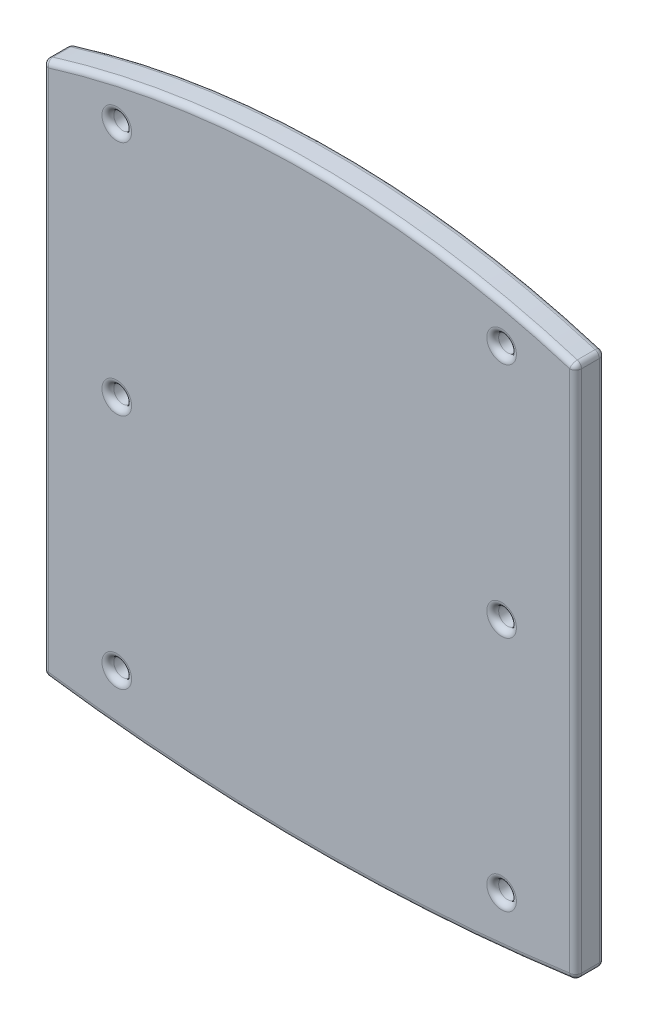
ISO-10303-21;
HEADER;
FILE_DESCRIPTION(('STEP AP214'),'2;1');
FILE_NAME('part.step','',(''),(''),'','','');
FILE_SCHEMA(('AUTOMOTIVE_DESIGN { 1 0 10303 214 1 1 1 1 }'));
ENDSEC;
DATA;
#1=APPLICATION_CONTEXT('core data for automotive mechanical design processes');
#2=APPLICATION_PROTOCOL_DEFINITION('international standard','automotive_design',2000,#1);
#3=PRODUCT_CONTEXT('',#1,'mechanical');
#4=PRODUCT('Part','Part','',(#3));
#5=PRODUCT_RELATED_PRODUCT_CATEGORY('part','',(#4));
#6=PRODUCT_DEFINITION_FORMATION('','',#4);
#7=PRODUCT_DEFINITION_CONTEXT('part definition',#1,'design');
#8=PRODUCT_DEFINITION('design','',#6,#7);
#9=PRODUCT_DEFINITION_SHAPE('','',#8);
#10=(LENGTH_UNIT() NAMED_UNIT(*) SI_UNIT(.MILLI.,.METRE.));
#11=(NAMED_UNIT(*) PLANE_ANGLE_UNIT() SI_UNIT($,.RADIAN.));
#12=(NAMED_UNIT(*) SI_UNIT($,.STERADIAN.) SOLID_ANGLE_UNIT());
#13=UNCERTAINTY_MEASURE_WITH_UNIT(LENGTH_MEASURE(1.E-05),#10,'distance_accuracy_value','');
#14=(GEOMETRIC_REPRESENTATION_CONTEXT(3) GLOBAL_UNCERTAINTY_ASSIGNED_CONTEXT((#13)) GLOBAL_UNIT_ASSIGNED_CONTEXT((#10,
#11,#12)) REPRESENTATION_CONTEXT('',''));
#15=CARTESIAN_POINT('',(0.,0.,0.));
#16=DIRECTION('',(0.,0.,1.));
#17=DIRECTION('',(1.,0.,0.));
#18=AXIS2_PLACEMENT_3D('',#15,#16,#17);
#19=CARTESIAN_POINT('',(65.,-80.,10.));
#20=DIRECTION('',(0.,0.,-1.));
#21=DIRECTION('',(-1.,0.,0.));
#22=AXIS2_PLACEMENT_3D('',#19,#20,#21);
#23=CYLINDRICAL_SURFACE('',#22,3.00000000000001);
#24=CARTESIAN_POINT('',(65.,-80.,8.));
#25=DIRECTION('',(0.,0.,1.));
#26=DIRECTION('',(1.,0.,0.));
#27=AXIS2_PLACEMENT_3D('',#24,#25,#26);
#28=CIRCLE('',#27,3.00000000000001);
#29=CARTESIAN_POINT('',(68.,-80.,8.));
#30=VERTEX_POINT('',#29);
#31=EDGE_CURVE('E189',#30,#30,#28,.T.);
#32=ORIENTED_EDGE('',*,*,#31,.T.);
#33=EDGE_LOOP('',(#32));
#34=FACE_BOUND('',#33,.T.);
#35=CARTESIAN_POINT('',(65.,-80.,2.));
#36=DIRECTION('',(0.,0.,1.));
#37=DIRECTION('',(1.,0.,0.));
#38=AXIS2_PLACEMENT_3D('',#35,#36,#37);
#39=CIRCLE('',#38,3.00000000000001);
#40=CARTESIAN_POINT('',(68.,-80.,2.));
#41=VERTEX_POINT('',#40);
#42=EDGE_CURVE('E185',#41,#41,#39,.F.);
#43=ORIENTED_EDGE('',*,*,#42,.T.);
#44=EDGE_LOOP('',(#43));
#45=FACE_BOUND('',#44,.T.);
#46=ADVANCED_FACE('F40',(#34,#45),#23,.F.);
#47=CARTESIAN_POINT('',(-65.,-80.,10.));
#48=DIRECTION('',(0.,0.,-1.));
#49=DIRECTION('',(-1.,0.,0.));
#50=AXIS2_PLACEMENT_3D('',#47,#48,#49);
#51=CYLINDRICAL_SURFACE('',#50,3.00000000000001);
#52=CARTESIAN_POINT('',(-65.,-80.,8.));
#53=DIRECTION('',(0.,0.,1.));
#54=DIRECTION('',(1.,0.,0.));
#55=AXIS2_PLACEMENT_3D('',#52,#53,#54);
#56=CIRCLE('',#55,3.00000000000001);
#57=CARTESIAN_POINT('',(-62.,-80.,8.));
#58=VERTEX_POINT('',#57);
#59=EDGE_CURVE('E234',#58,#58,#56,.T.);
#60=ORIENTED_EDGE('',*,*,#59,.T.);
#61=EDGE_LOOP('',(#60));
#62=FACE_BOUND('',#61,.T.);
#63=CARTESIAN_POINT('',(-65.,-80.,2.));
#64=DIRECTION('',(0.,0.,1.));
#65=DIRECTION('',(1.,0.,0.));
#66=AXIS2_PLACEMENT_3D('',#63,#64,#65);
#67=CIRCLE('',#66,3.00000000000001);
#68=CARTESIAN_POINT('',(-62.,-80.,2.));
#69=VERTEX_POINT('',#68);
#70=EDGE_CURVE('E230',#69,#69,#67,.F.);
#71=ORIENTED_EDGE('',*,*,#70,.T.);
#72=EDGE_LOOP('',(#71));
#73=FACE_BOUND('',#72,.T.);
#74=ADVANCED_FACE('F483',(#62,#73),#51,.F.);
#75=CARTESIAN_POINT('',(90.,0.,10.));
#76=DIRECTION('',(1.,0.,0.));
#77=DIRECTION('',(0.,1.,0.));
#78=AXIS2_PLACEMENT_3D('',#75,#76,#77);
#79=PLANE('',#78);
#80=DIRECTION('',(0.,-1.,0.));
#81=VECTOR('',#80,1.);
#82=CARTESIAN_POINT('',(90.,0.,8.));
#83=LINE('',#82,#81);
#84=CARTESIAN_POINT('',(90.,84.7952491438943,8.));
#85=VERTEX_POINT('',#84);
#86=CARTESIAN_POINT('',(90.,-91.9885850637983,8.));
#87=VERTEX_POINT('',#86);
#88=EDGE_CURVE('E276',#85,#87,#83,.T.);
#89=ORIENTED_EDGE('',*,*,#88,.T.);
#90=DIRECTION('',(0.,0.,-1.));
#91=VECTOR('',#90,1.);
#92=CARTESIAN_POINT('',(90.,-91.9885850637983,10.));
#93=LINE('',#92,#91);
#94=CARTESIAN_POINT('',(90.,-91.9885850637983,2.));
#95=VERTEX_POINT('',#94);
#96=EDGE_CURVE('E279',#87,#95,#93,.T.);
#97=ORIENTED_EDGE('',*,*,#96,.T.);
#98=DIRECTION('',(0.,-1.,0.));
#99=VECTOR('',#98,1.);
#100=CARTESIAN_POINT('',(90.,86.269555063544,2.));
#101=LINE('',#100,#99);
#102=CARTESIAN_POINT('',(90.,84.7952491438943,2.));
#103=VERTEX_POINT('',#102);
#104=EDGE_CURVE('E270',#95,#103,#101,.F.);
#105=ORIENTED_EDGE('',*,*,#104,.T.);
#106=DIRECTION('',(0.,0.,-1.));
#107=VECTOR('',#106,1.);
#108=CARTESIAN_POINT('',(90.,84.7952491438943,10.));
#109=LINE('',#108,#107);
#110=EDGE_CURVE('E273',#103,#85,#109,.F.);
#111=ORIENTED_EDGE('',*,*,#110,.T.);
#112=EDGE_LOOP('',(#89,#97,#105,#111));
#113=FACE_BOUND('',#112,.T.);
#114=ADVANCED_FACE('F430',(#113),#79,.T.);
#115=CARTESIAN_POINT('',(0.,-201.830172165288,10.));
#116=DIRECTION('',(0.,0.,-1.));
#117=DIRECTION('',(-1.,0.,0.));
#118=AXIS2_PLACEMENT_3D('',#115,#116,#117);
#119=CYLINDRICAL_SURFACE('',#118,301.830172165288);
#120=CARTESIAN_POINT('',(0.,-201.830172165288,8.));
#121=DIRECTION('',(0.,0.,1.));
#122=DIRECTION('',(1.,0.,0.));
#123=AXIS2_PLACEMENT_3D('',#120,#121,#122);
#124=CIRCLE('',#123,301.830172165288);
#125=CARTESIAN_POINT('',(-88.5869989625426,86.7071676091992,8.));
#126=VERTEX_POINT('',#125);
#127=CARTESIAN_POINT('',(88.5869989625426,86.7071676091992,8.));
#128=VERTEX_POINT('',#127);
#129=EDGE_CURVE('E289',#126,#128,#124,.F.);
#130=ORIENTED_EDGE('',*,*,#129,.T.);
#131=DIRECTION('',(0.,0.,-1.));
#132=VECTOR('',#131,1.);
#133=CARTESIAN_POINT('',(88.5869989625426,86.7071676091992,10.));
#134=LINE('',#133,#132);
#135=CARTESIAN_POINT('',(88.5869989625426,86.7071676091992,2.));
#136=VERTEX_POINT('',#135);
#137=EDGE_CURVE('E292',#128,#136,#134,.T.);
#138=ORIENTED_EDGE('',*,*,#137,.T.);
#139=CARTESIAN_POINT('',(0.,-201.830172165288,2.));
#140=DIRECTION('',(0.,0.,1.));
#141=DIRECTION('',(1.,0.,0.));
#142=AXIS2_PLACEMENT_3D('',#139,#140,#141);
#143=CIRCLE('',#142,301.830172165288);
#144=CARTESIAN_POINT('',(-88.5869989625426,86.7071676091992,2.));
#145=VERTEX_POINT('',#144);
#146=EDGE_CURVE('E283',#136,#145,#143,.T.);
#147=ORIENTED_EDGE('',*,*,#146,.T.);
#148=DIRECTION('',(0.,0.,-1.));
#149=VECTOR('',#148,1.);
#150=CARTESIAN_POINT('',(-88.5869989625426,86.7071676091992,10.));
#151=LINE('',#150,#149);
#152=EDGE_CURVE('E286',#145,#126,#151,.F.);
#153=ORIENTED_EDGE('',*,*,#152,.T.);
#154=EDGE_LOOP('',(#130,#138,#147,#153));
#155=FACE_BOUND('',#154,.T.);
#156=ADVANCED_FACE('F443',(#155),#119,.T.);
#157=CARTESIAN_POINT('',(-90.,0.,10.));
#158=DIRECTION('',(1.,0.,0.));
#159=DIRECTION('',(0.,1.,0.));
#160=AXIS2_PLACEMENT_3D('',#157,#158,#159);
#161=PLANE('',#160);
#162=DIRECTION('',(0.,-1.,0.));
#163=VECTOR('',#162,1.);
#164=CARTESIAN_POINT('',(-90.,0.,2.));
#165=LINE('',#164,#163);
#166=CARTESIAN_POINT('',(-90.,84.7952491438943,2.));
#167=VERTEX_POINT('',#166);
#168=CARTESIAN_POINT('',(-90.,-91.9885850637981,2.));
#169=VERTEX_POINT('',#168);
#170=EDGE_CURVE('E169',#167,#169,#165,.T.);
#171=ORIENTED_EDGE('',*,*,#170,.T.);
#172=DIRECTION('',(0.,0.,1.));
#173=VECTOR('',#172,1.);
#174=CARTESIAN_POINT('',(-90.,-91.9885850637981,10.));
#175=LINE('',#174,#173);
#176=CARTESIAN_POINT('',(-90.,-91.9885850637981,8.));
#177=VERTEX_POINT('',#176);
#178=EDGE_CURVE('E138',#169,#177,#175,.T.);
#179=ORIENTED_EDGE('',*,*,#178,.T.);
#180=DIRECTION('',(0.,-1.,0.));
#181=VECTOR('',#180,1.);
#182=CARTESIAN_POINT('',(-90.,86.2695550635439,8.));
#183=LINE('',#182,#181);
#184=CARTESIAN_POINT('',(-90.,84.7952491438943,8.));
#185=VERTEX_POINT('',#184);
#186=EDGE_CURVE('E180',#177,#185,#183,.F.);
#187=ORIENTED_EDGE('',*,*,#186,.T.);
#188=DIRECTION('',(0.,0.,1.));
#189=VECTOR('',#188,1.);
#190=CARTESIAN_POINT('',(-90.,84.7952491438943,0.));
#191=LINE('',#190,#189);
#192=EDGE_CURVE('E173',#185,#167,#191,.F.);
#193=ORIENTED_EDGE('',*,*,#192,.T.);
#194=EDGE_LOOP('',(#171,#179,#187,#193));
#195=FACE_BOUND('',#194,.T.);
#196=ADVANCED_FACE('F459',(#195),#161,.F.);
#197=CARTESIAN_POINT('',(0.,549.113632323209,10.));
#198=DIRECTION('',(0.,0.,-1.));
#199=DIRECTION('',(-1.,0.,0.));
#200=AXIS2_PLACEMENT_3D('',#197,#198,#199);
#201=CYLINDRICAL_SURFACE('',#200,649.113632323209);
#202=CARTESIAN_POINT('',(0.,549.113632323209,8.));
#203=DIRECTION('',(0.,0.,1.));
#204=DIRECTION('',(1.,0.,0.));
#205=AXIS2_PLACEMENT_3D('',#202,#203,#204);
#206=CIRCLE('',#205,649.113632323209);
#207=CARTESIAN_POINT('',(88.2719769623275,-93.9700059004614,8.));
#208=VERTEX_POINT('',#207);
#209=CARTESIAN_POINT('',(-88.2719769623275,-93.9700059004614,8.));
#210=VERTEX_POINT('',#209);
#211=EDGE_CURVE('E166',#208,#210,#206,.F.);
#212=ORIENTED_EDGE('',*,*,#211,.T.);
#213=DIRECTION('',(0.,0.,-1.));
#214=VECTOR('',#213,1.);
#215=CARTESIAN_POINT('',(-88.2719769623275,-93.9700059004616,10.));
#216=LINE('',#215,#214);
#217=CARTESIAN_POINT('',(-88.2719769623275,-93.9700059004614,2.));
#218=VERTEX_POINT('',#217);
#219=EDGE_CURVE('E136',#210,#218,#216,.T.);
#220=ORIENTED_EDGE('',*,*,#219,.T.);
#221=CARTESIAN_POINT('',(0.,549.113632323209,2.));
#222=DIRECTION('',(0.,0.,1.));
#223=DIRECTION('',(1.,0.,0.));
#224=AXIS2_PLACEMENT_3D('',#221,#222,#223);
#225=CIRCLE('',#224,649.113632323209);
#226=CARTESIAN_POINT('',(88.2719769623275,-93.9700059004614,2.));
#227=VERTEX_POINT('',#226);
#228=EDGE_CURVE('E155',#218,#227,#225,.T.);
#229=ORIENTED_EDGE('',*,*,#228,.T.);
#230=DIRECTION('',(0.,0.,-1.));
#231=VECTOR('',#230,1.);
#232=CARTESIAN_POINT('',(88.2719769623276,-93.9700059004616,10.));
#233=LINE('',#232,#231);
#234=EDGE_CURVE('E162',#227,#208,#233,.F.);
#235=ORIENTED_EDGE('',*,*,#234,.T.);
#236=EDGE_LOOP('',(#212,#220,#229,#235));
#237=FACE_BOUND('',#236,.T.);
#238=ADVANCED_FACE('F164',(#237),#201,.T.);
#239=CARTESIAN_POINT('',(0.,0.,10.));
#240=DIRECTION('',(0.,0.,1.));
#241=DIRECTION('',(1.,0.,0.));
#242=AXIS2_PLACEMENT_3D('',#239,#240,#241);
#243=PLANE('',#242);
#244=CARTESIAN_POINT('',(65.,-80.,10.));
#245=DIRECTION('',(0.,0.,1.));
#246=DIRECTION('',(1.,0.,0.));
#247=AXIS2_PLACEMENT_3D('',#244,#245,#246);
#248=CIRCLE('',#247,5.00000000000001);
#249=CARTESIAN_POINT('',(70.,-80.,10.));
#250=VERTEX_POINT('',#249);
#251=EDGE_CURVE('E226',#250,#250,#248,.F.);
#252=ORIENTED_EDGE('',*,*,#251,.T.);
#253=EDGE_LOOP('',(#252));
#254=FACE_BOUND('',#253,.T.);
#255=CARTESIAN_POINT('',(-65.,-80.,10.));
#256=DIRECTION('',(0.,0.,1.));
#257=DIRECTION('',(1.,0.,0.));
#258=AXIS2_PLACEMENT_3D('',#255,#256,#257);
#259=CIRCLE('',#258,5.00000000000001);
#260=CARTESIAN_POINT('',(-60.,-80.,10.));
#261=VERTEX_POINT('',#260);
#262=EDGE_CURVE('E222',#261,#261,#259,.F.);
#263=ORIENTED_EDGE('',*,*,#262,.T.);
#264=EDGE_LOOP('',(#263));
#265=FACE_BOUND('',#264,.T.);
#266=CARTESIAN_POINT('',(-65.,0.,10.));
#267=DIRECTION('',(0.,0.,1.));
#268=DIRECTION('',(1.,0.,0.));
#269=AXIS2_PLACEMENT_3D('',#266,#267,#268);
#270=CIRCLE('',#269,5.00000000000001);
#271=CARTESIAN_POINT('',(-60.,0.,10.));
#272=VERTEX_POINT('',#271);
#273=EDGE_CURVE('E218',#272,#272,#270,.F.);
#274=ORIENTED_EDGE('',*,*,#273,.T.);
#275=EDGE_LOOP('',(#274));
#276=FACE_BOUND('',#275,.T.);
#277=CARTESIAN_POINT('',(65.,0.,10.));
#278=DIRECTION('',(0.,0.,1.));
#279=DIRECTION('',(1.,0.,0.));
#280=AXIS2_PLACEMENT_3D('',#277,#278,#279);
#281=CIRCLE('',#280,5.00000000000001);
#282=CARTESIAN_POINT('',(70.,0.,10.));
#283=VERTEX_POINT('',#282);
#284=EDGE_CURVE('E214',#283,#283,#281,.F.);
#285=ORIENTED_EDGE('',*,*,#284,.T.);
#286=EDGE_LOOP('',(#285));
#287=FACE_BOUND('',#286,.T.);
#288=CARTESIAN_POINT('',(-65.,80.,10.));
#289=DIRECTION('',(0.,0.,1.));
#290=DIRECTION('',(1.,0.,0.));
#291=AXIS2_PLACEMENT_3D('',#288,#289,#290);
#292=CIRCLE('',#291,5.00000000000001);
#293=CARTESIAN_POINT('',(-60.,80.,10.));
#294=VERTEX_POINT('',#293);
#295=EDGE_CURVE('E210',#294,#294,#292,.F.);
#296=ORIENTED_EDGE('',*,*,#295,.T.);
#297=EDGE_LOOP('',(#296));
#298=FACE_BOUND('',#297,.T.);
#299=CARTESIAN_POINT('',(65.,80.,10.));
#300=DIRECTION('',(0.,0.,1.));
#301=DIRECTION('',(1.,0.,0.));
#302=AXIS2_PLACEMENT_3D('',#299,#300,#301);
#303=CIRCLE('',#302,5.00000000000001);
#304=CARTESIAN_POINT('',(70.,80.,10.));
#305=VERTEX_POINT('',#304);
#306=EDGE_CURVE('E206',#305,#305,#303,.F.);
#307=ORIENTED_EDGE('',*,*,#306,.T.);
#308=EDGE_LOOP('',(#307));
#309=FACE_BOUND('',#308,.T.);
#310=DIRECTION('',(0.,-1.,0.));
#311=VECTOR('',#310,1.);
#312=CARTESIAN_POINT('',(-88.,-93.7304449364561,10.));
#313=LINE('',#312,#311);
#314=CARTESIAN_POINT('',(-88.,84.7952491438942,10.));
#315=VERTEX_POINT('',#314);
#316=CARTESIAN_POINT('',(-88.,-91.9885850637982,10.));
#317=VERTEX_POINT('',#316);
#318=EDGE_CURVE('E199',#315,#317,#313,.T.);
#319=ORIENTED_EDGE('',*,*,#318,.T.);
#320=CARTESIAN_POINT('',(0.,549.113632323209,10.));
#321=DIRECTION('',(0.,0.,1.));
#322=DIRECTION('',(1.,0.,0.));
#323=AXIS2_PLACEMENT_3D('',#320,#321,#322);
#324=CIRCLE('',#323,647.113632323209);
#325=CARTESIAN_POINT('',(88.,-91.9885850637982,10.));
#326=VERTEX_POINT('',#325);
#327=EDGE_CURVE('E202',#317,#326,#324,.T.);
#328=ORIENTED_EDGE('',*,*,#327,.T.);
#329=DIRECTION('',(0.,-1.,0.));
#330=VECTOR('',#329,1.);
#331=CARTESIAN_POINT('',(88.,0.,10.));
#332=LINE('',#331,#330);
#333=CARTESIAN_POINT('',(88.,84.7952491438943,10.));
#334=VERTEX_POINT('',#333);
#335=EDGE_CURVE('E196',#326,#334,#332,.F.);
#336=ORIENTED_EDGE('',*,*,#335,.T.);
#337=CARTESIAN_POINT('',(0.,-201.830172165288,10.));
#338=DIRECTION('',(0.,0.,1.));
#339=DIRECTION('',(1.,0.,0.));
#340=AXIS2_PLACEMENT_3D('',#337,#338,#339);
#341=CIRCLE('',#340,299.830172165288);
#342=EDGE_CURVE('E193',#334,#315,#341,.T.);
#343=ORIENTED_EDGE('',*,*,#342,.T.);
#344=EDGE_LOOP('',(#319,#328,#336,#343));
#345=FACE_BOUND('',#344,.T.);
#346=ADVANCED_FACE('F421',(#254,#265,#276,#287,#298,#309,#345),#243,.T.);
#347=CARTESIAN_POINT('',(0.,0.,0.));
#348=DIRECTION('',(0.,0.,1.));
#349=DIRECTION('',(1.,0.,0.));
#350=AXIS2_PLACEMENT_3D('',#347,#348,#349);
#351=PLANE('',#350);
#352=CARTESIAN_POINT('',(65.,-80.,0.));
#353=DIRECTION('',(0.,0.,1.));
#354=DIRECTION('',(1.,0.,0.));
#355=AXIS2_PLACEMENT_3D('',#352,#353,#354);
#356=CIRCLE('',#355,5.00000000000001);
#357=CARTESIAN_POINT('',(70.,-80.,0.));
#358=VERTEX_POINT('',#357);
#359=EDGE_CURVE('E11',#358,#358,#356,.T.);
#360=ORIENTED_EDGE('',*,*,#359,.T.);
#361=EDGE_LOOP('',(#360));
#362=FACE_BOUND('',#361,.T.);
#363=CARTESIAN_POINT('',(-65.,-80.,0.));
#364=DIRECTION('',(0.,0.,1.));
#365=DIRECTION('',(1.,0.,0.));
#366=AXIS2_PLACEMENT_3D('',#363,#364,#365);
#367=CIRCLE('',#366,5.00000000000001);
#368=CARTESIAN_POINT('',(-60.,-80.,0.));
#369=VERTEX_POINT('',#368);
#370=EDGE_CURVE('E50',#369,#369,#367,.T.);
#371=ORIENTED_EDGE('',*,*,#370,.T.);
#372=EDGE_LOOP('',(#371));
#373=FACE_BOUND('',#372,.T.);
#374=DIRECTION('',(0.,-1.,0.));
#375=VECTOR('',#374,1.);
#376=CARTESIAN_POINT('',(-88.,0.,0.));
#377=LINE('',#376,#375);
#378=CARTESIAN_POINT('',(-88.,-91.9885850637982,0.));
#379=VERTEX_POINT('',#378);
#380=CARTESIAN_POINT('',(-88.,84.7952491438942,0.));
#381=VERTEX_POINT('',#380);
#382=EDGE_CURVE('E58',#379,#381,#377,.F.);
#383=ORIENTED_EDGE('',*,*,#382,.T.);
#384=CARTESIAN_POINT('',(0.,-201.830172165288,0.));
#385=DIRECTION('',(0.,0.,1.));
#386=DIRECTION('',(1.,0.,0.));
#387=AXIS2_PLACEMENT_3D('',#384,#385,#386);
#388=CIRCLE('',#387,299.830172165288);
#389=CARTESIAN_POINT('',(88.,84.7952491438943,0.));
#390=VERTEX_POINT('',#389);
#391=EDGE_CURVE('E319',#381,#390,#388,.F.);
#392=ORIENTED_EDGE('',*,*,#391,.T.);
#393=DIRECTION('',(0.,-1.,0.));
#394=VECTOR('',#393,1.);
#395=CARTESIAN_POINT('',(88.,-93.730444936456,0.));
#396=LINE('',#395,#394);
#397=CARTESIAN_POINT('',(88.,-91.9885850637982,0.));
#398=VERTEX_POINT('',#397);
#399=EDGE_CURVE('E312',#390,#398,#396,.T.);
#400=ORIENTED_EDGE('',*,*,#399,.T.);
#401=CARTESIAN_POINT('',(0.,549.113632323209,0.));
#402=DIRECTION('',(0.,0.,1.));
#403=DIRECTION('',(1.,0.,0.));
#404=AXIS2_PLACEMENT_3D('',#401,#402,#403);
#405=CIRCLE('',#404,647.113632323209);
#406=EDGE_CURVE('E63',#398,#379,#405,.F.);
#407=ORIENTED_EDGE('',*,*,#406,.T.);
#408=EDGE_LOOP('',(#383,#392,#400,#407));
#409=FACE_BOUND('',#408,.T.);
#410=CARTESIAN_POINT('',(-65.,0.,0.));
#411=DIRECTION('',(0.,0.,1.));
#412=DIRECTION('',(1.,0.,0.));
#413=AXIS2_PLACEMENT_3D('',#410,#411,#412);
#414=CIRCLE('',#413,5.00000000000001);
#415=CARTESIAN_POINT('',(-60.,0.,0.));
#416=VERTEX_POINT('',#415);
#417=EDGE_CURVE('E308',#416,#416,#414,.T.);
#418=ORIENTED_EDGE('',*,*,#417,.T.);
#419=EDGE_LOOP('',(#418));
#420=FACE_BOUND('',#419,.T.);
#421=CARTESIAN_POINT('',(65.,0.,0.));
#422=DIRECTION('',(0.,0.,1.));
#423=DIRECTION('',(1.,0.,0.));
#424=AXIS2_PLACEMENT_3D('',#421,#422,#423);
#425=CIRCLE('',#424,5.00000000000001);
#426=CARTESIAN_POINT('',(70.,0.,0.));
#427=VERTEX_POINT('',#426);
#428=EDGE_CURVE('E304',#427,#427,#425,.T.);
#429=ORIENTED_EDGE('',*,*,#428,.T.);
#430=EDGE_LOOP('',(#429));
#431=FACE_BOUND('',#430,.T.);
#432=CARTESIAN_POINT('',(-65.,80.,0.));
#433=DIRECTION('',(0.,0.,1.));
#434=DIRECTION('',(1.,0.,0.));
#435=AXIS2_PLACEMENT_3D('',#432,#433,#434);
#436=CIRCLE('',#435,5.00000000000001);
#437=CARTESIAN_POINT('',(-60.,80.,0.));
#438=VERTEX_POINT('',#437);
#439=EDGE_CURVE('E300',#438,#438,#436,.T.);
#440=ORIENTED_EDGE('',*,*,#439,.T.);
#441=EDGE_LOOP('',(#440));
#442=FACE_BOUND('',#441,.T.);
#443=CARTESIAN_POINT('',(65.,80.,0.));
#444=DIRECTION('',(0.,0.,1.));
#445=DIRECTION('',(1.,0.,0.));
#446=AXIS2_PLACEMENT_3D('',#443,#444,#445);
#447=CIRCLE('',#446,5.00000000000001);
#448=CARTESIAN_POINT('',(70.,80.,0.));
#449=VERTEX_POINT('',#448);
#450=EDGE_CURVE('E296',#449,#449,#447,.T.);
#451=ORIENTED_EDGE('',*,*,#450,.T.);
#452=EDGE_LOOP('',(#451));
#453=FACE_BOUND('',#452,.T.);
#454=ADVANCED_FACE('F797',(#362,#373,#409,#420,#431,#442,#453),#351,.F.);
#455=CARTESIAN_POINT('',(-65.,0.,10.));
#456=DIRECTION('',(0.,0.,-1.));
#457=DIRECTION('',(-1.,0.,0.));
#458=AXIS2_PLACEMENT_3D('',#455,#456,#457);
#459=CYLINDRICAL_SURFACE('',#458,3.00000000000001);
#460=CARTESIAN_POINT('',(-65.,0.,8.));
#461=DIRECTION('',(0.,0.,1.));
#462=DIRECTION('',(1.,0.,0.));
#463=AXIS2_PLACEMENT_3D('',#460,#461,#462);
#464=CIRCLE('',#463,3.00000000000001);
#465=CARTESIAN_POINT('',(-62.,0.,8.));
#466=VERTEX_POINT('',#465);
#467=EDGE_CURVE('E242',#466,#466,#464,.T.);
#468=ORIENTED_EDGE('',*,*,#467,.T.);
#469=EDGE_LOOP('',(#468));
#470=FACE_BOUND('',#469,.T.);
#471=CARTESIAN_POINT('',(-65.,0.,2.));
#472=DIRECTION('',(0.,0.,1.));
#473=DIRECTION('',(1.,0.,0.));
#474=AXIS2_PLACEMENT_3D('',#471,#472,#473);
#475=CIRCLE('',#474,3.00000000000001);
#476=CARTESIAN_POINT('',(-62.,0.,2.));
#477=VERTEX_POINT('',#476);
#478=EDGE_CURVE('E238',#477,#477,#475,.F.);
#479=ORIENTED_EDGE('',*,*,#478,.T.);
#480=EDGE_LOOP('',(#479));
#481=FACE_BOUND('',#480,.T.);
#482=ADVANCED_FACE('F778',(#470,#481),#459,.F.);
#483=CARTESIAN_POINT('',(65.,0.,10.));
#484=DIRECTION('',(0.,0.,-1.));
#485=DIRECTION('',(-1.,0.,0.));
#486=AXIS2_PLACEMENT_3D('',#483,#484,#485);
#487=CYLINDRICAL_SURFACE('',#486,3.00000000000001);
#488=CARTESIAN_POINT('',(65.,0.,8.));
#489=DIRECTION('',(0.,0.,1.));
#490=DIRECTION('',(1.,0.,0.));
#491=AXIS2_PLACEMENT_3D('',#488,#489,#490);
#492=CIRCLE('',#491,3.00000000000001);
#493=CARTESIAN_POINT('',(68.,0.,8.));
#494=VERTEX_POINT('',#493);
#495=EDGE_CURVE('E250',#494,#494,#492,.T.);
#496=ORIENTED_EDGE('',*,*,#495,.T.);
#497=EDGE_LOOP('',(#496));
#498=FACE_BOUND('',#497,.T.);
#499=CARTESIAN_POINT('',(65.,0.,2.));
#500=DIRECTION('',(0.,0.,1.));
#501=DIRECTION('',(1.,0.,0.));
#502=AXIS2_PLACEMENT_3D('',#499,#500,#501);
#503=CIRCLE('',#502,3.00000000000001);
#504=CARTESIAN_POINT('',(68.,0.,2.));
#505=VERTEX_POINT('',#504);
#506=EDGE_CURVE('E246',#505,#505,#503,.F.);
#507=ORIENTED_EDGE('',*,*,#506,.T.);
#508=EDGE_LOOP('',(#507));
#509=FACE_BOUND('',#508,.T.);
#510=ADVANCED_FACE('F769',(#498,#509),#487,.F.);
#511=CARTESIAN_POINT('',(-65.,80.,10.));
#512=DIRECTION('',(0.,0.,-1.));
#513=DIRECTION('',(-1.,0.,0.));
#514=AXIS2_PLACEMENT_3D('',#511,#512,#513);
#515=CYLINDRICAL_SURFACE('',#514,3.00000000000001);
#516=CARTESIAN_POINT('',(-65.,80.,8.));
#517=DIRECTION('',(0.,0.,1.));
#518=DIRECTION('',(1.,0.,0.));
#519=AXIS2_PLACEMENT_3D('',#516,#517,#518);
#520=CIRCLE('',#519,3.00000000000001);
#521=CARTESIAN_POINT('',(-62.,80.,8.));
#522=VERTEX_POINT('',#521);
#523=EDGE_CURVE('E258',#522,#522,#520,.T.);
#524=ORIENTED_EDGE('',*,*,#523,.T.);
#525=EDGE_LOOP('',(#524));
#526=FACE_BOUND('',#525,.T.);
#527=CARTESIAN_POINT('',(-65.,80.,2.));
#528=DIRECTION('',(0.,0.,1.));
#529=DIRECTION('',(1.,0.,0.));
#530=AXIS2_PLACEMENT_3D('',#527,#528,#529);
#531=CIRCLE('',#530,3.00000000000001);
#532=CARTESIAN_POINT('',(-62.,80.,2.));
#533=VERTEX_POINT('',#532);
#534=EDGE_CURVE('E254',#533,#533,#531,.F.);
#535=ORIENTED_EDGE('',*,*,#534,.T.);
#536=EDGE_LOOP('',(#535));
#537=FACE_BOUND('',#536,.T.);
#538=ADVANCED_FACE('F760',(#526,#537),#515,.F.);
#539=CARTESIAN_POINT('',(65.,80.,10.));
#540=DIRECTION('',(0.,0.,-1.));
#541=DIRECTION('',(-1.,0.,0.));
#542=AXIS2_PLACEMENT_3D('',#539,#540,#541);
#543=CYLINDRICAL_SURFACE('',#542,3.00000000000001);
#544=CARTESIAN_POINT('',(65.,80.,8.));
#545=DIRECTION('',(0.,0.,1.));
#546=DIRECTION('',(1.,0.,0.));
#547=AXIS2_PLACEMENT_3D('',#544,#545,#546);
#548=CIRCLE('',#547,3.00000000000001);
#549=CARTESIAN_POINT('',(68.,80.,8.));
#550=VERTEX_POINT('',#549);
#551=EDGE_CURVE('E266',#550,#550,#548,.T.);
#552=ORIENTED_EDGE('',*,*,#551,.T.);
#553=EDGE_LOOP('',(#552));
#554=FACE_BOUND('',#553,.T.);
#555=CARTESIAN_POINT('',(65.,80.,2.));
#556=DIRECTION('',(0.,0.,1.));
#557=DIRECTION('',(1.,0.,0.));
#558=AXIS2_PLACEMENT_3D('',#555,#556,#557);
#559=CIRCLE('',#558,3.00000000000001);
#560=CARTESIAN_POINT('',(68.,80.,2.));
#561=VERTEX_POINT('',#560);
#562=EDGE_CURVE('E262',#561,#561,#559,.F.);
#563=ORIENTED_EDGE('',*,*,#562,.T.);
#564=EDGE_LOOP('',(#563));
#565=FACE_BOUND('',#564,.T.);
#566=ADVANCED_FACE('F752',(#554,#565),#543,.F.);
#567=CARTESIAN_POINT('',(88.,84.7952491438943,10.));
#568=DIRECTION('',(0.,0.,-1.));
#569=DIRECTION('',(-1.,0.,0.));
#570=AXIS2_PLACEMENT_3D('',#567,#568,#569);
#571=CYLINDRICAL_SURFACE('',#570,2.);
#572=CARTESIAN_POINT('',(88.,84.7952491438943,8.));
#573=DIRECTION('',(0.,0.,1.));
#574=DIRECTION('',(1.,0.,0.));
#575=AXIS2_PLACEMENT_3D('',#572,#573,#574);
#576=CIRCLE('',#575,2.);
#577=EDGE_CURVE('E44',#85,#128,#576,.T.);
#578=ORIENTED_EDGE('',*,*,#577,.F.);
#579=ORIENTED_EDGE('',*,*,#110,.F.);
#580=CARTESIAN_POINT('',(88.,84.7952491438943,2.));
#581=DIRECTION('',(0.,0.,-1.));
#582=DIRECTION('',(-1.,0.,0.));
#583=AXIS2_PLACEMENT_3D('',#580,#581,#582);
#584=CIRCLE('',#583,2.);
#585=EDGE_CURVE('E395',#136,#103,#584,.T.);
#586=ORIENTED_EDGE('',*,*,#585,.F.);
#587=ORIENTED_EDGE('',*,*,#137,.F.);
#588=EDGE_LOOP('',(#578,#579,#586,#587));
#589=FACE_BOUND('',#588,.T.);
#590=ADVANCED_FACE('F441',(#589),#571,.T.);
#591=CARTESIAN_POINT('',(88.,84.7952491438943,8.));
#592=DIRECTION('',(0.,0.,1.));
#593=DIRECTION('',(1.,0.,0.));
#594=AXIS2_PLACEMENT_3D('',#591,#592,#593);
#595=SPHERICAL_SURFACE('',#594,2.);
#596=CARTESIAN_POINT('',(88.,84.7952491438943,8.));
#597=DIRECTION('',(0.,1.,0.));
#598=DIRECTION('',(-1.,0.,0.));
#599=AXIS2_PLACEMENT_3D('',#596,#597,#598);
#600=CIRCLE('',#599,2.);
#601=EDGE_CURVE('E388',#85,#334,#600,.F.);
#602=ORIENTED_EDGE('',*,*,#601,.F.);
#603=ORIENTED_EDGE('',*,*,#577,.T.);
#604=CARTESIAN_POINT('',(88.,84.7952491438943,8.));
#605=DIRECTION('',(0.955959232652455,-0.293499481271311,0.));
#606=DIRECTION('',(0.293499481271311,0.955959232652456,0.));
#607=AXIS2_PLACEMENT_3D('',#604,#605,#606);
#608=CIRCLE('',#607,2.);
#609=EDGE_CURVE('E392',#334,#128,#608,.F.);
#610=ORIENTED_EDGE('',*,*,#609,.F.);
#611=EDGE_LOOP('',(#602,#603,#610));
#612=FACE_BOUND('',#611,.T.);
#613=ADVANCED_FACE('F408',(#612),#595,.T.);
#614=CARTESIAN_POINT('',(88.,84.7952491438943,2.));
#615=DIRECTION('',(0.,0.,1.));
#616=DIRECTION('',(1.,0.,0.));
#617=AXIS2_PLACEMENT_3D('',#614,#615,#616);
#618=SPHERICAL_SURFACE('',#617,2.);
#619=CARTESIAN_POINT('',(88.,84.7952491438943,2.));
#620=DIRECTION('',(0.955959232652455,-0.293499481271313,0.));
#621=DIRECTION('',(0.293499481271313,0.955959232652455,0.));
#622=AXIS2_PLACEMENT_3D('',#619,#620,#621);
#623=CIRCLE('',#622,2.);
#624=EDGE_CURVE('E380',#136,#390,#623,.F.);
#625=ORIENTED_EDGE('',*,*,#624,.F.);
#626=ORIENTED_EDGE('',*,*,#585,.T.);
#627=CARTESIAN_POINT('',(88.,84.7952491438943,2.));
#628=DIRECTION('',(0.,1.,0.));
#629=DIRECTION('',(0.,0.,1.));
#630=AXIS2_PLACEMENT_3D('',#627,#628,#629);
#631=CIRCLE('',#630,2.);
#632=EDGE_CURVE('E384',#390,#103,#631,.F.);
#633=ORIENTED_EDGE('',*,*,#632,.F.);
#634=EDGE_LOOP('',(#625,#626,#633));
#635=FACE_BOUND('',#634,.T.);
#636=ADVANCED_FACE('F730',(#635),#618,.T.);
#637=CARTESIAN_POINT('',(0.,-201.830172165288,8.));
#638=DIRECTION('',(0.,0.,1.));
#639=DIRECTION('',(1.,0.,0.));
#640=AXIS2_PLACEMENT_3D('',#637,#638,#639);
#641=TOROIDAL_SURFACE('',#640,299.830172165288,2.);
#642=ORIENTED_EDGE('',*,*,#609,.T.);
#643=ORIENTED_EDGE('',*,*,#129,.F.);
#644=CARTESIAN_POINT('',(-88.,84.7952491438942,8.));
#645=DIRECTION('',(-0.955959232652457,-0.293499481271305,0.));
#646=DIRECTION('',(0.293499481271305,-0.955959232652457,0.));
#647=AXIS2_PLACEMENT_3D('',#644,#645,#646);
#648=CIRCLE('',#647,2.);
#649=EDGE_CURVE('E372',#315,#126,#648,.T.);
#650=ORIENTED_EDGE('',*,*,#649,.F.);
#651=ORIENTED_EDGE('',*,*,#342,.F.);
#652=EDGE_LOOP('',(#642,#643,#650,#651));
#653=FACE_BOUND('',#652,.T.);
#654=ADVANCED_FACE('F416',(#653),#641,.T.);
#655=CARTESIAN_POINT('',(88.,0.,8.));
#656=DIRECTION('',(0.,-1.,0.));
#657=DIRECTION('',(1.,0.,0.));
#658=AXIS2_PLACEMENT_3D('',#655,#656,#657);
#659=CYLINDRICAL_SURFACE('',#658,2.);
#660=ORIENTED_EDGE('',*,*,#601,.T.);
#661=ORIENTED_EDGE('',*,*,#335,.F.);
#662=CARTESIAN_POINT('',(88.,-91.9885850637983,8.));
#663=DIRECTION('',(0.,-1.,0.));
#664=DIRECTION('',(0.,0.,-1.));
#665=AXIS2_PLACEMENT_3D('',#662,#663,#664);
#666=CIRCLE('',#665,2.);
#667=EDGE_CURVE('E368',#87,#326,#666,.T.);
#668=ORIENTED_EDGE('',*,*,#667,.F.);
#669=ORIENTED_EDGE('',*,*,#88,.F.);
#670=EDGE_LOOP('',(#660,#661,#668,#669));
#671=FACE_BOUND('',#670,.T.);
#672=ADVANCED_FACE('F427',(#671),#659,.T.);
#673=CARTESIAN_POINT('',(88.,-91.9885850637983,10.));
#674=DIRECTION('',(0.,0.,-1.));
#675=DIRECTION('',(-1.,0.,0.));
#676=AXIS2_PLACEMENT_3D('',#673,#674,#675);
#677=CYLINDRICAL_SURFACE('',#676,2.);
#678=CARTESIAN_POINT('',(88.,-91.9885850637983,2.));
#679=DIRECTION('',(0.,0.,-1.));
#680=DIRECTION('',(-1.,0.,0.));
#681=AXIS2_PLACEMENT_3D('',#678,#679,#680);
#682=CIRCLE('',#681,2.);
#683=EDGE_CURVE('E360',#95,#227,#682,.T.);
#684=ORIENTED_EDGE('',*,*,#683,.F.);
#685=ORIENTED_EDGE('',*,*,#96,.F.);
#686=CARTESIAN_POINT('',(88.,-91.9885850637982,8.));
#687=DIRECTION('',(0.,0.,1.));
#688=DIRECTION('',(1.,0.,0.));
#689=AXIS2_PLACEMENT_3D('',#686,#687,#688);
#690=CIRCLE('',#689,2.);
#691=EDGE_CURVE('E364',#208,#87,#690,.T.);
#692=ORIENTED_EDGE('',*,*,#691,.F.);
#693=ORIENTED_EDGE('',*,*,#234,.F.);
#694=EDGE_LOOP('',(#684,#685,#692,#693));
#695=FACE_BOUND('',#694,.T.);
#696=ADVANCED_FACE('F434',(#695),#677,.T.);
#697=CARTESIAN_POINT('',(88.,0.,2.));
#698=DIRECTION('',(0.,1.,0.));
#699=DIRECTION('',(-1.,0.,0.));
#700=AXIS2_PLACEMENT_3D('',#697,#698,#699);
#701=CYLINDRICAL_SURFACE('',#700,2.);
#702=ORIENTED_EDGE('',*,*,#632,.T.);
#703=ORIENTED_EDGE('',*,*,#104,.F.);
#704=CARTESIAN_POINT('',(88.,-91.9885850637982,2.));
#705=DIRECTION('',(0.,-1.,0.));
#706=DIRECTION('',(1.,0.,0.));
#707=AXIS2_PLACEMENT_3D('',#704,#705,#706);
#708=CIRCLE('',#707,2.);
#709=EDGE_CURVE('E357',#398,#95,#708,.T.);
#710=ORIENTED_EDGE('',*,*,#709,.F.);
#711=ORIENTED_EDGE('',*,*,#399,.F.);
#712=EDGE_LOOP('',(#702,#703,#710,#711));
#713=FACE_BOUND('',#712,.T.);
#714=ADVANCED_FACE('F440',(#713),#701,.T.);
#715=CARTESIAN_POINT('',(0.,-201.830172165288,2.));
#716=DIRECTION('',(0.,0.,1.));
#717=DIRECTION('',(1.,0.,0.));
#718=AXIS2_PLACEMENT_3D('',#715,#716,#717);
#719=TOROIDAL_SURFACE('',#718,299.830172165288,2.);
#720=ORIENTED_EDGE('',*,*,#624,.T.);
#721=ORIENTED_EDGE('',*,*,#391,.F.);
#722=CARTESIAN_POINT('',(-88.,84.7952491438943,2.));
#723=DIRECTION('',(-0.955959232652455,-0.293499481271311,0.));
#724=DIRECTION('',(0.293499481271311,-0.955959232652456,0.));
#725=AXIS2_PLACEMENT_3D('',#722,#723,#724);
#726=CIRCLE('',#725,2.);
#727=EDGE_CURVE('E353',#145,#381,#726,.T.);
#728=ORIENTED_EDGE('',*,*,#727,.F.);
#729=ORIENTED_EDGE('',*,*,#146,.F.);
#730=EDGE_LOOP('',(#720,#721,#728,#729));
#731=FACE_BOUND('',#730,.T.);
#732=ADVANCED_FACE('F452',(#731),#719,.T.);
#733=CARTESIAN_POINT('',(-88.,84.7952491438943,10.));
#734=DIRECTION('',(0.,0.,-1.));
#735=DIRECTION('',(-1.,0.,0.));
#736=AXIS2_PLACEMENT_3D('',#733,#734,#735);
#737=CYLINDRICAL_SURFACE('',#736,2.);
#738=CARTESIAN_POINT('',(-88.,84.7952491438943,8.));
#739=DIRECTION('',(0.,0.,1.));
#740=DIRECTION('',(1.,0.,0.));
#741=AXIS2_PLACEMENT_3D('',#738,#739,#740);
#742=CIRCLE('',#741,2.);
#743=EDGE_CURVE('E376',#126,#185,#742,.T.);
#744=ORIENTED_EDGE('',*,*,#743,.F.);
#745=ORIENTED_EDGE('',*,*,#152,.F.);
#746=CARTESIAN_POINT('',(-88.,84.7952491438943,2.));
#747=DIRECTION('',(0.,0.,-1.));
#748=DIRECTION('',(-1.,0.,0.));
#749=AXIS2_PLACEMENT_3D('',#746,#747,#748);
#750=CIRCLE('',#749,2.);
#751=EDGE_CURVE('E349',#167,#145,#750,.T.);
#752=ORIENTED_EDGE('',*,*,#751,.F.);
#753=ORIENTED_EDGE('',*,*,#192,.F.);
#754=EDGE_LOOP('',(#744,#745,#752,#753));
#755=FACE_BOUND('',#754,.T.);
#756=ADVANCED_FACE('F448',(#755),#737,.T.);
#757=CARTESIAN_POINT('',(-88.,84.7952491438943,8.));
#758=DIRECTION('',(0.,0.,1.));
#759=DIRECTION('',(1.,0.,0.));
#760=AXIS2_PLACEMENT_3D('',#757,#758,#759);
#761=SPHERICAL_SURFACE('',#760,2.);
#762=ORIENTED_EDGE('',*,*,#649,.T.);
#763=ORIENTED_EDGE('',*,*,#743,.T.);
#764=CARTESIAN_POINT('',(-88.,84.7952491438943,8.));
#765=DIRECTION('',(0.,1.,0.));
#766=DIRECTION('',(0.,0.,1.));
#767=AXIS2_PLACEMENT_3D('',#764,#765,#766);
#768=CIRCLE('',#767,2.);
#769=EDGE_CURVE('E345',#315,#185,#768,.F.);
#770=ORIENTED_EDGE('',*,*,#769,.F.);
#771=EDGE_LOOP('',(#762,#763,#770));
#772=FACE_BOUND('',#771,.T.);
#773=ADVANCED_FACE('F462',(#772),#761,.T.);
#774=CARTESIAN_POINT('',(88.,-91.9885850637981,8.));
#775=DIRECTION('',(0.,0.,1.));
#776=DIRECTION('',(1.,0.,0.));
#777=AXIS2_PLACEMENT_3D('',#774,#775,#776);
#778=SPHERICAL_SURFACE('',#777,2.);
#779=ORIENTED_EDGE('',*,*,#691,.T.);
#780=ORIENTED_EDGE('',*,*,#667,.T.);
#781=CARTESIAN_POINT('',(88.,-91.9885850637982,8.));
#782=DIRECTION('',(0.9907104183316,0.13598848116376,0.));
#783=DIRECTION('',(-0.13598848116376,0.9907104183316,0.));
#784=AXIS2_PLACEMENT_3D('',#781,#782,#783);
#785=CIRCLE('',#784,2.);
#786=EDGE_CURVE('E342',#208,#326,#785,.F.);
#787=ORIENTED_EDGE('',*,*,#786,.F.);
#788=EDGE_LOOP('',(#779,#780,#787));
#789=FACE_BOUND('',#788,.T.);
#790=ADVANCED_FACE('F472',(#789),#778,.T.);
#791=CARTESIAN_POINT('',(88.,-91.9885850637981,2.));
#792=DIRECTION('',(0.,0.,1.));
#793=DIRECTION('',(1.,0.,0.));
#794=AXIS2_PLACEMENT_3D('',#791,#792,#793);
#795=SPHERICAL_SURFACE('',#794,2.);
#796=ORIENTED_EDGE('',*,*,#709,.T.);
#797=ORIENTED_EDGE('',*,*,#683,.T.);
#798=CARTESIAN_POINT('',(88.,-91.9885850637982,2.));
#799=DIRECTION('',(0.990710418331599,0.135988481163765,0.));
#800=DIRECTION('',(-0.135988481163765,0.990710418331599,0.));
#801=AXIS2_PLACEMENT_3D('',#798,#799,#800);
#802=CIRCLE('',#801,2.);
#803=EDGE_CURVE('E158',#398,#227,#802,.F.);
#804=ORIENTED_EDGE('',*,*,#803,.F.);
#805=EDGE_LOOP('',(#796,#797,#804));
#806=FACE_BOUND('',#805,.T.);
#807=ADVANCED_FACE('F474',(#806),#795,.T.);
#808=CARTESIAN_POINT('',(-88.,84.7952491438943,2.));
#809=DIRECTION('',(0.,0.,1.));
#810=DIRECTION('',(1.,0.,0.));
#811=AXIS2_PLACEMENT_3D('',#808,#809,#810);
#812=SPHERICAL_SURFACE('',#811,2.);
#813=ORIENTED_EDGE('',*,*,#751,.T.);
#814=ORIENTED_EDGE('',*,*,#727,.T.);
#815=CARTESIAN_POINT('',(-88.,84.7952491438942,2.));
#816=DIRECTION('',(0.,1.,0.));
#817=DIRECTION('',(-1.,0.,0.));
#818=AXIS2_PLACEMENT_3D('',#815,#816,#817);
#819=CIRCLE('',#818,2.);
#820=EDGE_CURVE('E336',#167,#381,#819,.F.);
#821=ORIENTED_EDGE('',*,*,#820,.F.);
#822=EDGE_LOOP('',(#813,#814,#821));
#823=FACE_BOUND('',#822,.T.);
#824=ADVANCED_FACE('F454',(#823),#812,.T.);
#825=CARTESIAN_POINT('',(-88.,0.,8.));
#826=DIRECTION('',(0.,1.,0.));
#827=DIRECTION('',(-1.,0.,0.));
#828=AXIS2_PLACEMENT_3D('',#825,#826,#827);
#829=CYLINDRICAL_SURFACE('',#828,2.);
#830=ORIENTED_EDGE('',*,*,#769,.T.);
#831=ORIENTED_EDGE('',*,*,#186,.F.);
#832=CARTESIAN_POINT('',(-88.,-91.9885850637982,8.));
#833=DIRECTION('',(0.,-1.,0.));
#834=DIRECTION('',(1.,0.,0.));
#835=AXIS2_PLACEMENT_3D('',#832,#833,#834);
#836=CIRCLE('',#835,2.);
#837=EDGE_CURVE('E332',#317,#177,#836,.T.);
#838=ORIENTED_EDGE('',*,*,#837,.F.);
#839=ORIENTED_EDGE('',*,*,#318,.F.);
#840=EDGE_LOOP('',(#830,#831,#838,#839));
#841=FACE_BOUND('',#840,.T.);
#842=ADVANCED_FACE('F464',(#841),#829,.T.);
#843=CARTESIAN_POINT('',(0.,549.113632323209,8.));
#844=DIRECTION('',(0.,0.,1.));
#845=DIRECTION('',(1.,0.,0.));
#846=AXIS2_PLACEMENT_3D('',#843,#844,#845);
#847=TOROIDAL_SURFACE('',#846,647.113632323209,2.);
#848=ORIENTED_EDGE('',*,*,#786,.T.);
#849=ORIENTED_EDGE('',*,*,#327,.F.);
#850=CARTESIAN_POINT('',(-87.9999999999999,-91.9885850637982,8.));
#851=DIRECTION('',(-0.990710418331599,0.135988481163765,0.));
#852=DIRECTION('',(-0.135988481163765,-0.990710418331599,0.));
#853=AXIS2_PLACEMENT_3D('',#850,#851,#852);
#854=CIRCLE('',#853,2.);
#855=EDGE_CURVE('E152',#210,#317,#854,.T.);
#856=ORIENTED_EDGE('',*,*,#855,.F.);
#857=ORIENTED_EDGE('',*,*,#211,.F.);
#858=EDGE_LOOP('',(#848,#849,#856,#857));
#859=FACE_BOUND('',#858,.T.);
#860=ADVANCED_FACE('F470',(#859),#847,.T.);
#861=CARTESIAN_POINT('',(0.,549.113632323209,2.));
#862=DIRECTION('',(0.,0.,1.));
#863=DIRECTION('',(1.,0.,0.));
#864=AXIS2_PLACEMENT_3D('',#861,#862,#863);
#865=TOROIDAL_SURFACE('',#864,647.113632323209,2.);
#866=ORIENTED_EDGE('',*,*,#803,.T.);
#867=ORIENTED_EDGE('',*,*,#228,.F.);
#868=CARTESIAN_POINT('',(-88.,-91.9885850637982,2.));
#869=DIRECTION('',(-0.990710418331601,0.135988481163754,0.));
#870=DIRECTION('',(-0.135988481163754,-0.990710418331601,0.));
#871=AXIS2_PLACEMENT_3D('',#868,#869,#870);
#872=CIRCLE('',#871,2.);
#873=EDGE_CURVE('E145',#379,#218,#872,.T.);
#874=ORIENTED_EDGE('',*,*,#873,.F.);
#875=ORIENTED_EDGE('',*,*,#406,.F.);
#876=EDGE_LOOP('',(#866,#867,#874,#875));
#877=FACE_BOUND('',#876,.T.);
#878=ADVANCED_FACE('F156',(#877),#865,.T.);
#879=CARTESIAN_POINT('',(-88.,0.,2.));
#880=DIRECTION('',(0.,-1.,0.));
#881=DIRECTION('',(1.,0.,0.));
#882=AXIS2_PLACEMENT_3D('',#879,#880,#881);
#883=CYLINDRICAL_SURFACE('',#882,2.);
#884=ORIENTED_EDGE('',*,*,#820,.T.);
#885=ORIENTED_EDGE('',*,*,#382,.F.);
#886=CARTESIAN_POINT('',(-88.,-91.9885850637981,2.));
#887=DIRECTION('',(0.,-1.,0.));
#888=DIRECTION('',(0.,0.,-1.));
#889=AXIS2_PLACEMENT_3D('',#886,#887,#888);
#890=CIRCLE('',#889,2.);
#891=EDGE_CURVE('E149',#169,#379,#890,.T.);
#892=ORIENTED_EDGE('',*,*,#891,.F.);
#893=ORIENTED_EDGE('',*,*,#170,.F.);
#894=EDGE_LOOP('',(#884,#885,#892,#893));
#895=FACE_BOUND('',#894,.T.);
#896=ADVANCED_FACE('F457',(#895),#883,.T.);
#897=CARTESIAN_POINT('',(-88.,-91.9885850637983,8.));
#898=DIRECTION('',(0.,0.,1.));
#899=DIRECTION('',(1.,0.,0.));
#900=AXIS2_PLACEMENT_3D('',#897,#898,#899);
#901=SPHERICAL_SURFACE('',#900,2.);
#902=ORIENTED_EDGE('',*,*,#855,.T.);
#903=ORIENTED_EDGE('',*,*,#837,.T.);
#904=CARTESIAN_POINT('',(-88.,-91.9885850637981,8.));
#905=DIRECTION('',(0.,0.,1.));
#906=DIRECTION('',(1.,0.,0.));
#907=AXIS2_PLACEMENT_3D('',#904,#905,#906);
#908=CIRCLE('',#907,2.);
#909=EDGE_CURVE('E142',#210,#177,#908,.F.);
#910=ORIENTED_EDGE('',*,*,#909,.F.);
#911=EDGE_LOOP('',(#902,#903,#910));
#912=FACE_BOUND('',#911,.T.);
#913=ADVANCED_FACE('F468',(#912),#901,.T.);
#914=CARTESIAN_POINT('',(-88.,-91.9885850637983,2.));
#915=DIRECTION('',(0.,0.,1.));
#916=DIRECTION('',(1.,0.,0.));
#917=AXIS2_PLACEMENT_3D('',#914,#915,#916);
#918=SPHERICAL_SURFACE('',#917,2.);
#919=ORIENTED_EDGE('',*,*,#891,.T.);
#920=ORIENTED_EDGE('',*,*,#873,.T.);
#921=CARTESIAN_POINT('',(-87.9999999999999,-91.9885850637982,2.));
#922=DIRECTION('',(0.,0.,-1.));
#923=DIRECTION('',(-1.,0.,0.));
#924=AXIS2_PLACEMENT_3D('',#921,#922,#923);
#925=CIRCLE('',#924,2.);
#926=EDGE_CURVE('E132',#169,#218,#925,.F.);
#927=ORIENTED_EDGE('',*,*,#926,.F.);
#928=EDGE_LOOP('',(#919,#920,#927));
#929=FACE_BOUND('',#928,.T.);
#930=ADVANCED_FACE('F147',(#929),#918,.T.);
#931=CARTESIAN_POINT('',(-87.9999999999999,-91.9885850637981,10.));
#932=DIRECTION('',(0.,0.,-1.));
#933=DIRECTION('',(-1.,0.,0.));
#934=AXIS2_PLACEMENT_3D('',#931,#932,#933);
#935=CYLINDRICAL_SURFACE('',#934,2.);
#936=ORIENTED_EDGE('',*,*,#909,.T.);
#937=ORIENTED_EDGE('',*,*,#178,.F.);
#938=ORIENTED_EDGE('',*,*,#926,.T.);
#939=ORIENTED_EDGE('',*,*,#219,.F.);
#940=EDGE_LOOP('',(#936,#937,#938,#939));
#941=FACE_BOUND('',#940,.T.);
#942=ADVANCED_FACE('F134',(#941),#935,.T.);
#943=CARTESIAN_POINT('',(65.,-80.,8.));
#944=DIRECTION('',(0.,0.,1.));
#945=DIRECTION('',(1.,0.,0.));
#946=AXIS2_PLACEMENT_3D('',#943,#944,#945);
#947=TOROIDAL_SURFACE('',#946,5.00000000000001,2.);
#948=ORIENTED_EDGE('',*,*,#251,.F.);
#949=EDGE_LOOP('',(#948));
#950=FACE_BOUND('',#949,.T.);
#951=ORIENTED_EDGE('',*,*,#31,.F.);
#952=EDGE_LOOP('',(#951));
#953=FACE_BOUND('',#952,.T.);
#954=ADVANCED_FACE('F496',(#950,#953),#947,.T.);
#955=CARTESIAN_POINT('',(-65.,-80.,8.));
#956=DIRECTION('',(0.,0.,1.));
#957=DIRECTION('',(1.,0.,0.));
#958=AXIS2_PLACEMENT_3D('',#955,#956,#957);
#959=TOROIDAL_SURFACE('',#958,5.00000000000001,2.);
#960=ORIENTED_EDGE('',*,*,#262,.F.);
#961=EDGE_LOOP('',(#960));
#962=FACE_BOUND('',#961,.T.);
#963=ORIENTED_EDGE('',*,*,#59,.F.);
#964=EDGE_LOOP('',(#963));
#965=FACE_BOUND('',#964,.T.);
#966=ADVANCED_FACE('F548',(#962,#965),#959,.T.);
#967=CARTESIAN_POINT('',(-65.,0.,8.));
#968=DIRECTION('',(0.,0.,1.));
#969=DIRECTION('',(1.,0.,0.));
#970=AXIS2_PLACEMENT_3D('',#967,#968,#969);
#971=TOROIDAL_SURFACE('',#970,5.00000000000001,2.);
#972=ORIENTED_EDGE('',*,*,#273,.F.);
#973=EDGE_LOOP('',(#972));
#974=FACE_BOUND('',#973,.T.);
#975=ORIENTED_EDGE('',*,*,#467,.F.);
#976=EDGE_LOOP('',(#975));
#977=FACE_BOUND('',#976,.T.);
#978=ADVANCED_FACE('F556',(#974,#977),#971,.T.);
#979=CARTESIAN_POINT('',(65.,0.,8.));
#980=DIRECTION('',(0.,0.,1.));
#981=DIRECTION('',(1.,0.,0.));
#982=AXIS2_PLACEMENT_3D('',#979,#980,#981);
#983=TOROIDAL_SURFACE('',#982,5.00000000000001,2.);
#984=ORIENTED_EDGE('',*,*,#284,.F.);
#985=EDGE_LOOP('',(#984));
#986=FACE_BOUND('',#985,.T.);
#987=ORIENTED_EDGE('',*,*,#495,.F.);
#988=EDGE_LOOP('',(#987));
#989=FACE_BOUND('',#988,.T.);
#990=ADVANCED_FACE('F564',(#986,#989),#983,.T.);
#991=CARTESIAN_POINT('',(-65.,80.,8.));
#992=DIRECTION('',(0.,0.,1.));
#993=DIRECTION('',(1.,0.,0.));
#994=AXIS2_PLACEMENT_3D('',#991,#992,#993);
#995=TOROIDAL_SURFACE('',#994,5.00000000000001,2.);
#996=ORIENTED_EDGE('',*,*,#295,.F.);
#997=EDGE_LOOP('',(#996));
#998=FACE_BOUND('',#997,.T.);
#999=ORIENTED_EDGE('',*,*,#523,.F.);
#1000=EDGE_LOOP('',(#999));
#1001=FACE_BOUND('',#1000,.T.);
#1002=ADVANCED_FACE('F572',(#998,#1001),#995,.T.);
#1003=CARTESIAN_POINT('',(65.,80.,8.));
#1004=DIRECTION('',(0.,0.,1.));
#1005=DIRECTION('',(1.,0.,0.));
#1006=AXIS2_PLACEMENT_3D('',#1003,#1004,#1005);
#1007=TOROIDAL_SURFACE('',#1006,5.00000000000001,2.);
#1008=ORIENTED_EDGE('',*,*,#306,.F.);
#1009=EDGE_LOOP('',(#1008));
#1010=FACE_BOUND('',#1009,.T.);
#1011=ORIENTED_EDGE('',*,*,#551,.F.);
#1012=EDGE_LOOP('',(#1011));
#1013=FACE_BOUND('',#1012,.T.);
#1014=ADVANCED_FACE('F580',(#1010,#1013),#1007,.T.);
#1015=CARTESIAN_POINT('',(65.,-80.,2.));
#1016=DIRECTION('',(0.,0.,1.));
#1017=DIRECTION('',(1.,0.,0.));
#1018=AXIS2_PLACEMENT_3D('',#1015,#1016,#1017);
#1019=TOROIDAL_SURFACE('',#1018,5.00000000000001,2.);
#1020=ORIENTED_EDGE('',*,*,#42,.F.);
#1021=EDGE_LOOP('',(#1020));
#1022=FACE_BOUND('',#1021,.T.);
#1023=ORIENTED_EDGE('',*,*,#359,.F.);
#1024=EDGE_LOOP('',(#1023));
#1025=FACE_BOUND('',#1024,.T.);
#1026=ADVANCED_FACE('F588',(#1022,#1025),#1019,.T.);
#1027=CARTESIAN_POINT('',(-65.,-80.,2.));
#1028=DIRECTION('',(0.,0.,1.));
#1029=DIRECTION('',(1.,0.,0.));
#1030=AXIS2_PLACEMENT_3D('',#1027,#1028,#1029);
#1031=TOROIDAL_SURFACE('',#1030,5.00000000000001,2.);
#1032=ORIENTED_EDGE('',*,*,#70,.F.);
#1033=EDGE_LOOP('',(#1032));
#1034=FACE_BOUND('',#1033,.T.);
#1035=ORIENTED_EDGE('',*,*,#370,.F.);
#1036=EDGE_LOOP('',(#1035));
#1037=FACE_BOUND('',#1036,.T.);
#1038=ADVANCED_FACE('F596',(#1034,#1037),#1031,.T.);
#1039=CARTESIAN_POINT('',(-65.,0.,2.));
#1040=DIRECTION('',(0.,0.,1.));
#1041=DIRECTION('',(1.,0.,0.));
#1042=AXIS2_PLACEMENT_3D('',#1039,#1040,#1041);
#1043=TOROIDAL_SURFACE('',#1042,5.00000000000001,2.);
#1044=ORIENTED_EDGE('',*,*,#478,.F.);
#1045=EDGE_LOOP('',(#1044));
#1046=FACE_BOUND('',#1045,.T.);
#1047=ORIENTED_EDGE('',*,*,#417,.F.);
#1048=EDGE_LOOP('',(#1047));
#1049=FACE_BOUND('',#1048,.T.);
#1050=ADVANCED_FACE('F604',(#1046,#1049),#1043,.T.);
#1051=CARTESIAN_POINT('',(65.,0.,2.));
#1052=DIRECTION('',(0.,0.,1.));
#1053=DIRECTION('',(1.,0.,0.));
#1054=AXIS2_PLACEMENT_3D('',#1051,#1052,#1053);
#1055=TOROIDAL_SURFACE('',#1054,5.00000000000001,2.);
#1056=ORIENTED_EDGE('',*,*,#506,.F.);
#1057=EDGE_LOOP('',(#1056));
#1058=FACE_BOUND('',#1057,.T.);
#1059=ORIENTED_EDGE('',*,*,#428,.F.);
#1060=EDGE_LOOP('',(#1059));
#1061=FACE_BOUND('',#1060,.T.);
#1062=ADVANCED_FACE('F612',(#1058,#1061),#1055,.T.);
#1063=CARTESIAN_POINT('',(-65.,80.,2.));
#1064=DIRECTION('',(0.,0.,1.));
#1065=DIRECTION('',(1.,0.,0.));
#1066=AXIS2_PLACEMENT_3D('',#1063,#1064,#1065);
#1067=TOROIDAL_SURFACE('',#1066,5.00000000000001,2.);
#1068=ORIENTED_EDGE('',*,*,#534,.F.);
#1069=EDGE_LOOP('',(#1068));
#1070=FACE_BOUND('',#1069,.T.);
#1071=ORIENTED_EDGE('',*,*,#439,.F.);
#1072=EDGE_LOOP('',(#1071));
#1073=FACE_BOUND('',#1072,.T.);
#1074=ADVANCED_FACE('F620',(#1070,#1073),#1067,.T.);
#1075=CARTESIAN_POINT('',(65.,80.,2.));
#1076=DIRECTION('',(0.,0.,1.));
#1077=DIRECTION('',(1.,0.,0.));
#1078=AXIS2_PLACEMENT_3D('',#1075,#1076,#1077);
#1079=TOROIDAL_SURFACE('',#1078,5.00000000000001,2.);
#1080=ORIENTED_EDGE('',*,*,#562,.F.);
#1081=EDGE_LOOP('',(#1080));
#1082=FACE_BOUND('',#1081,.T.);
#1083=ORIENTED_EDGE('',*,*,#450,.F.);
#1084=EDGE_LOOP('',(#1083));
#1085=FACE_BOUND('',#1084,.T.);
#1086=ADVANCED_FACE('F42',(#1082,#1085),#1079,.T.);
#1087=CLOSED_SHELL('',(#46,#74,#114,#156,#196,#238,#346,#454,#482,#510,#538,#566,#590,#613,#636,
#654,#672,#696,#714,#732,#756,#773,#790,#807,#824,#842,#860,#878,#896,#913,#930,#942,#954,#966,
#978,#990,#1002,#1014,#1026,#1038,#1050,#1062,#1074,#1086));
#1088=MANIFOLD_SOLID_BREP('B2',#1087);
#1089=ADVANCED_BREP_SHAPE_REPRESENTATION('',(#18,#1088),#14);
#1090=SHAPE_DEFINITION_REPRESENTATION(#9,#1089);
ENDSEC;
END-ISO-10303-21;
